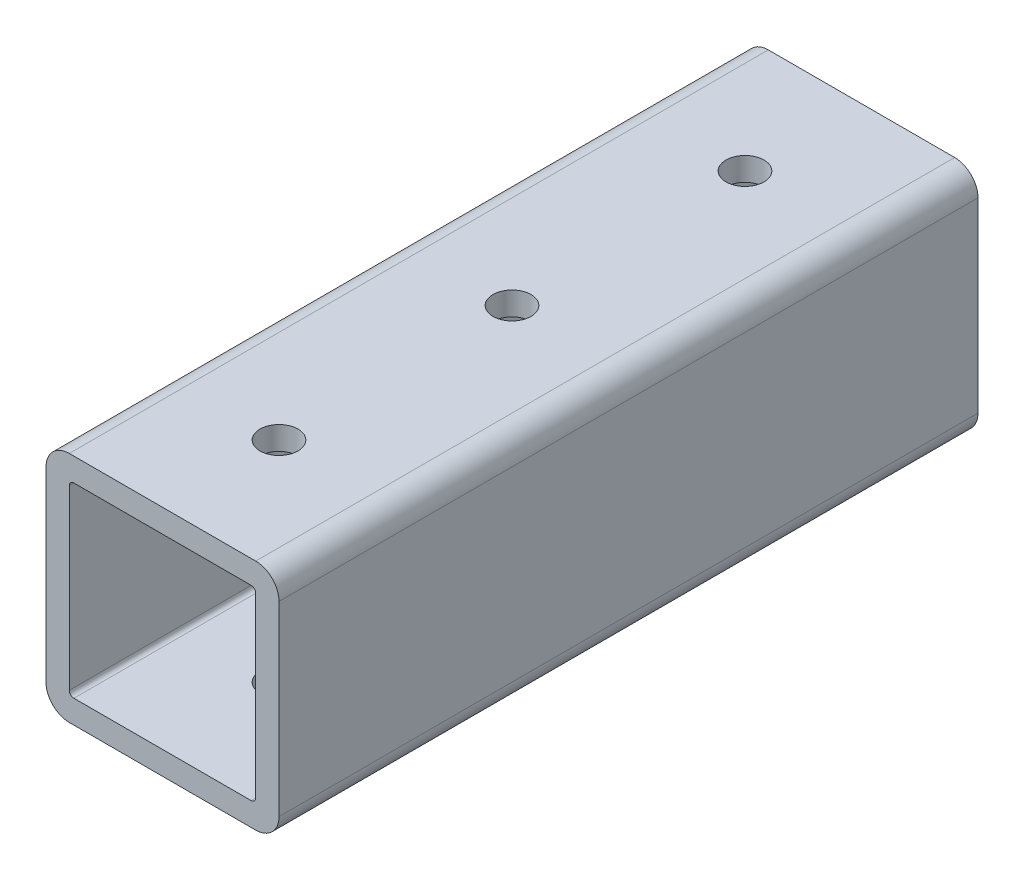
ISO-10303-21;
HEADER;
FILE_DESCRIPTION(('STEP AP214'),'2;1');
FILE_NAME('part.step','',(''),(''),'','','');
FILE_SCHEMA(('AUTOMOTIVE_DESIGN { 1 0 10303 214 1 1 1 1 }'));
ENDSEC;
DATA;
#1=APPLICATION_CONTEXT('core data for automotive mechanical design processes');
#2=APPLICATION_PROTOCOL_DEFINITION('international standard','automotive_design',2000,#1);
#3=PRODUCT_CONTEXT('',#1,'mechanical');
#4=PRODUCT('Part','Part','',(#3));
#5=PRODUCT_RELATED_PRODUCT_CATEGORY('part','',(#4));
#6=PRODUCT_DEFINITION_FORMATION('','',#4);
#7=PRODUCT_DEFINITION_CONTEXT('part definition',#1,'design');
#8=PRODUCT_DEFINITION('design','',#6,#7);
#9=PRODUCT_DEFINITION_SHAPE('','',#8);
#10=(LENGTH_UNIT() NAMED_UNIT(*) SI_UNIT(.MILLI.,.METRE.));
#11=(NAMED_UNIT(*) PLANE_ANGLE_UNIT() SI_UNIT($,.RADIAN.));
#12=(NAMED_UNIT(*) SI_UNIT($,.STERADIAN.) SOLID_ANGLE_UNIT());
#13=UNCERTAINTY_MEASURE_WITH_UNIT(LENGTH_MEASURE(1.E-05),#10,'distance_accuracy_value','');
#14=(GEOMETRIC_REPRESENTATION_CONTEXT(3) GLOBAL_UNCERTAINTY_ASSIGNED_CONTEXT((#13)) GLOBAL_UNIT_ASSIGNED_CONTEXT((#10,
#11,#12)) REPRESENTATION_CONTEXT('',''));
#15=CARTESIAN_POINT('',(0.,0.,0.));
#16=DIRECTION('',(0.,0.,1.));
#17=DIRECTION('',(1.,0.,0.));
#18=AXIS2_PLACEMENT_3D('',#15,#16,#17);
#19=CARTESIAN_POINT('',(-9.65999999999999,9.66,749.3));
#20=DIRECTION('',(0.,0.,1.));
#21=DIRECTION('',(1.,0.,0.));
#22=AXIS2_PLACEMENT_3D('',#19,#20,#21);
#23=CYLINDRICAL_SURFACE('',#22,0.5);
#24=DIRECTION('',(0.,0.,-1.));
#25=VECTOR('',#24,1.);
#26=CARTESIAN_POINT('',(-10.16,9.66,749.3));
#27=LINE('',#26,#25);
#28=CARTESIAN_POINT('',(-10.16,9.66,673.1));
#29=VERTEX_POINT('',#28);
#30=CARTESIAN_POINT('',(-10.16,9.66,749.3));
#31=VERTEX_POINT('',#30);
#32=EDGE_CURVE('E204',#29,#31,#27,.F.);
#33=ORIENTED_EDGE('',*,*,#32,.F.);
#34=CARTESIAN_POINT('',(-9.65999999999999,9.66,673.1));
#35=DIRECTION('',(0.,0.,1.));
#36=DIRECTION('',(1.,0.,0.));
#37=AXIS2_PLACEMENT_3D('',#34,#35,#36);
#38=CIRCLE('',#37,0.5);
#39=CARTESIAN_POINT('',(-9.65999999999999,10.16,673.1));
#40=VERTEX_POINT('',#39);
#41=EDGE_CURVE('E286',#29,#40,#38,.F.);
#42=ORIENTED_EDGE('',*,*,#41,.T.);
#43=DIRECTION('',(0.,0.,-1.));
#44=VECTOR('',#43,1.);
#45=CARTESIAN_POINT('',(-9.65999999999999,10.16,749.3));
#46=LINE('',#45,#44);
#47=CARTESIAN_POINT('',(-9.65999999999999,10.16,749.3));
#48=VERTEX_POINT('',#47);
#49=EDGE_CURVE('E251',#48,#40,#46,.T.);
#50=ORIENTED_EDGE('',*,*,#49,.F.);
#51=CARTESIAN_POINT('',(-9.65999999999999,9.66,749.3));
#52=DIRECTION('',(0.,0.,1.));
#53=DIRECTION('',(1.,0.,0.));
#54=AXIS2_PLACEMENT_3D('',#51,#52,#53);
#55=CIRCLE('',#54,0.5);
#56=EDGE_CURVE('E280',#31,#48,#55,.F.);
#57=ORIENTED_EDGE('',*,*,#56,.F.);
#58=EDGE_LOOP('',(#33,#42,#50,#57));
#59=FACE_BOUND('',#58,.T.);
#60=ADVANCED_FACE('F39',(#59),#23,.F.);
#61=CARTESIAN_POINT('',(0.,-12.7,685.8));
#62=DIRECTION('',(0.,1.,0.));
#63=DIRECTION('',(0.,0.,1.));
#64=AXIS2_PLACEMENT_3D('',#61,#62,#63);
#65=CYLINDRICAL_SURFACE('',#64,2.07009999999996);
#66=CARTESIAN_POINT('',(0.,10.16,685.8));
#67=DIRECTION('',(0.,1.,0.));
#68=DIRECTION('',(0.,0.,1.));
#69=AXIS2_PLACEMENT_3D('',#66,#67,#68);
#70=CIRCLE('',#69,2.07009999999996);
#71=CARTESIAN_POINT('',(0.,10.16,687.8701));
#72=VERTEX_POINT('',#71);
#73=EDGE_CURVE('E248',#72,#72,#70,.T.);
#74=ORIENTED_EDGE('',*,*,#73,.F.);
#75=EDGE_LOOP('',(#74));
#76=FACE_BOUND('',#75,.T.);
#77=CARTESIAN_POINT('',(0.,12.7,685.8));
#78=DIRECTION('',(0.,1.,0.));
#79=DIRECTION('',(0.,0.,1.));
#80=AXIS2_PLACEMENT_3D('',#77,#78,#79);
#81=CIRCLE('',#80,2.07009999999996);
#82=CARTESIAN_POINT('',(0.,12.7,687.8701));
#83=VERTEX_POINT('',#82);
#84=EDGE_CURVE('E272',#83,#83,#81,.T.);
#85=ORIENTED_EDGE('',*,*,#84,.T.);
#86=EDGE_LOOP('',(#85));
#87=FACE_BOUND('',#86,.T.);
#88=ADVANCED_FACE('F365',(#76,#87),#65,.F.);
#89=CARTESIAN_POINT('',(0.,-12.7,711.2));
#90=DIRECTION('',(0.,1.,0.));
#91=DIRECTION('',(0.,0.,1.));
#92=AXIS2_PLACEMENT_3D('',#89,#90,#91);
#93=CYLINDRICAL_SURFACE('',#92,2.07009999999996);
#94=CARTESIAN_POINT('',(0.,10.16,711.2));
#95=DIRECTION('',(0.,1.,0.));
#96=DIRECTION('',(0.,0.,1.));
#97=AXIS2_PLACEMENT_3D('',#94,#95,#96);
#98=CIRCLE('',#97,2.07009999999996);
#99=CARTESIAN_POINT('',(0.,10.16,713.2701));
#100=VERTEX_POINT('',#99);
#101=EDGE_CURVE('E245',#100,#100,#98,.T.);
#102=ORIENTED_EDGE('',*,*,#101,.F.);
#103=EDGE_LOOP('',(#102));
#104=FACE_BOUND('',#103,.T.);
#105=CARTESIAN_POINT('',(0.,12.7,711.2));
#106=DIRECTION('',(0.,1.,0.));
#107=DIRECTION('',(0.,0.,1.));
#108=AXIS2_PLACEMENT_3D('',#105,#106,#107);
#109=CIRCLE('',#108,2.07009999999996);
#110=CARTESIAN_POINT('',(0.,12.7,713.2701));
#111=VERTEX_POINT('',#110);
#112=EDGE_CURVE('E269',#111,#111,#109,.T.);
#113=ORIENTED_EDGE('',*,*,#112,.T.);
#114=EDGE_LOOP('',(#113));
#115=FACE_BOUND('',#114,.T.);
#116=ADVANCED_FACE('F372',(#104,#115),#93,.F.);
#117=CARTESIAN_POINT('',(0.,-12.7,736.6));
#118=DIRECTION('',(0.,1.,0.));
#119=DIRECTION('',(0.,0.,1.));
#120=AXIS2_PLACEMENT_3D('',#117,#118,#119);
#121=CYLINDRICAL_SURFACE('',#120,2.07009999999996);
#122=CARTESIAN_POINT('',(0.,10.16,736.6));
#123=DIRECTION('',(0.,1.,0.));
#124=DIRECTION('',(0.,0.,1.));
#125=AXIS2_PLACEMENT_3D('',#122,#123,#124);
#126=CIRCLE('',#125,2.07009999999996);
#127=CARTESIAN_POINT('',(0.,10.16,738.6701));
#128=VERTEX_POINT('',#127);
#129=EDGE_CURVE('E198',#128,#128,#126,.T.);
#130=ORIENTED_EDGE('',*,*,#129,.F.);
#131=EDGE_LOOP('',(#130));
#132=FACE_BOUND('',#131,.T.);
#133=CARTESIAN_POINT('',(0.,12.7,736.6));
#134=DIRECTION('',(0.,1.,0.));
#135=DIRECTION('',(0.,0.,1.));
#136=AXIS2_PLACEMENT_3D('',#133,#134,#135);
#137=CIRCLE('',#136,2.07009999999996);
#138=CARTESIAN_POINT('',(0.,12.7,738.6701));
#139=VERTEX_POINT('',#138);
#140=EDGE_CURVE('E266',#139,#139,#137,.T.);
#141=ORIENTED_EDGE('',*,*,#140,.T.);
#142=EDGE_LOOP('',(#141));
#143=FACE_BOUND('',#142,.T.);
#144=ADVANCED_FACE('F437',(#132,#143),#121,.F.);
#145=CARTESIAN_POINT('',(9.66,9.65999999999999,749.3));
#146=DIRECTION('',(0.,0.,1.));
#147=DIRECTION('',(1.,0.,0.));
#148=AXIS2_PLACEMENT_3D('',#145,#146,#147);
#149=CYLINDRICAL_SURFACE('',#148,0.5);
#150=DIRECTION('',(0.,0.,-1.));
#151=VECTOR('',#150,1.);
#152=CARTESIAN_POINT('',(9.66,10.16,749.3));
#153=LINE('',#152,#151);
#154=CARTESIAN_POINT('',(9.66,10.16,673.1));
#155=VERTEX_POINT('',#154);
#156=CARTESIAN_POINT('',(9.66,10.16,749.3));
#157=VERTEX_POINT('',#156);
#158=EDGE_CURVE('E203',#155,#157,#153,.F.);
#159=ORIENTED_EDGE('',*,*,#158,.F.);
#160=CARTESIAN_POINT('',(9.66,9.65999999999999,673.1));
#161=DIRECTION('',(0.,0.,1.));
#162=DIRECTION('',(1.,0.,0.));
#163=AXIS2_PLACEMENT_3D('',#160,#161,#162);
#164=CIRCLE('',#163,0.5);
#165=CARTESIAN_POINT('',(10.16,9.65999999999999,673.1));
#166=VERTEX_POINT('',#165);
#167=EDGE_CURVE('E290',#155,#166,#164,.F.);
#168=ORIENTED_EDGE('',*,*,#167,.T.);
#169=DIRECTION('',(0.,0.,1.));
#170=VECTOR('',#169,1.);
#171=CARTESIAN_POINT('',(10.16,9.65999999999999,749.3));
#172=LINE('',#171,#170);
#173=CARTESIAN_POINT('',(10.16,9.65999999999999,749.3));
#174=VERTEX_POINT('',#173);
#175=EDGE_CURVE('E194',#174,#166,#172,.F.);
#176=ORIENTED_EDGE('',*,*,#175,.F.);
#177=CARTESIAN_POINT('',(9.66,9.65999999999999,749.3));
#178=DIRECTION('',(0.,0.,1.));
#179=DIRECTION('',(1.,0.,0.));
#180=AXIS2_PLACEMENT_3D('',#177,#178,#179);
#181=CIRCLE('',#180,0.5);
#182=EDGE_CURVE('E279',#157,#174,#181,.F.);
#183=ORIENTED_EDGE('',*,*,#182,.F.);
#184=EDGE_LOOP('',(#159,#168,#176,#183));
#185=FACE_BOUND('',#184,.T.);
#186=ADVANCED_FACE('F392',(#185),#149,.F.);
#187=CARTESIAN_POINT('',(-9.65999999999999,-9.66,749.3));
#188=DIRECTION('',(0.,0.,1.));
#189=DIRECTION('',(1.,0.,0.));
#190=AXIS2_PLACEMENT_3D('',#187,#188,#189);
#191=CYLINDRICAL_SURFACE('',#190,0.5);
#192=DIRECTION('',(0.,0.,1.));
#193=VECTOR('',#192,1.);
#194=CARTESIAN_POINT('',(-9.65999999999999,-10.16,749.3));
#195=LINE('',#194,#193);
#196=CARTESIAN_POINT('',(-9.65999999999999,-10.16,673.1));
#197=VERTEX_POINT('',#196);
#198=CARTESIAN_POINT('',(-9.65999999999999,-10.16,749.3));
#199=VERTEX_POINT('',#198);
#200=EDGE_CURVE('E200',#197,#199,#195,.T.);
#201=ORIENTED_EDGE('',*,*,#200,.F.);
#202=CARTESIAN_POINT('',(-9.65999999999999,-9.66,673.1));
#203=DIRECTION('',(0.,0.,1.));
#204=DIRECTION('',(1.,0.,0.));
#205=AXIS2_PLACEMENT_3D('',#202,#203,#204);
#206=CIRCLE('',#205,0.5);
#207=CARTESIAN_POINT('',(-10.16,-9.66,673.1));
#208=VERTEX_POINT('',#207);
#209=EDGE_CURVE('E61',#197,#208,#206,.F.);
#210=ORIENTED_EDGE('',*,*,#209,.T.);
#211=DIRECTION('',(0.,0.,-1.));
#212=VECTOR('',#211,1.);
#213=CARTESIAN_POINT('',(-10.16,-9.66,749.3));
#214=LINE('',#213,#212);
#215=CARTESIAN_POINT('',(-10.16,-9.66,749.3));
#216=VERTEX_POINT('',#215);
#217=EDGE_CURVE('E201',#216,#208,#214,.T.);
#218=ORIENTED_EDGE('',*,*,#217,.F.);
#219=CARTESIAN_POINT('',(-9.65999999999999,-9.66,749.3));
#220=DIRECTION('',(0.,0.,1.));
#221=DIRECTION('',(1.,0.,0.));
#222=AXIS2_PLACEMENT_3D('',#219,#220,#221);
#223=CIRCLE('',#222,0.5);
#224=EDGE_CURVE('E277',#199,#216,#223,.F.);
#225=ORIENTED_EDGE('',*,*,#224,.F.);
#226=EDGE_LOOP('',(#201,#210,#218,#225));
#227=FACE_BOUND('',#226,.T.);
#228=ADVANCED_FACE('F381',(#227),#191,.F.);
#229=CARTESIAN_POINT('',(9.66,-9.66,749.3));
#230=DIRECTION('',(0.,0.,1.));
#231=DIRECTION('',(1.,0.,0.));
#232=AXIS2_PLACEMENT_3D('',#229,#230,#231);
#233=CYLINDRICAL_SURFACE('',#232,0.5);
#234=DIRECTION('',(0.,0.,1.));
#235=VECTOR('',#234,1.);
#236=CARTESIAN_POINT('',(10.16,-9.66,749.3));
#237=LINE('',#236,#235);
#238=CARTESIAN_POINT('',(10.16,-9.66,673.1));
#239=VERTEX_POINT('',#238);
#240=CARTESIAN_POINT('',(10.16,-9.66,749.3));
#241=VERTEX_POINT('',#240);
#242=EDGE_CURVE('E197',#239,#241,#237,.T.);
#243=ORIENTED_EDGE('',*,*,#242,.F.);
#244=CARTESIAN_POINT('',(9.66,-9.66,673.1));
#245=DIRECTION('',(0.,0.,1.));
#246=DIRECTION('',(1.,0.,0.));
#247=AXIS2_PLACEMENT_3D('',#244,#245,#246);
#248=CIRCLE('',#247,0.5);
#249=CARTESIAN_POINT('',(9.66,-10.16,673.1));
#250=VERTEX_POINT('',#249);
#251=EDGE_CURVE('E299',#239,#250,#248,.F.);
#252=ORIENTED_EDGE('',*,*,#251,.T.);
#253=DIRECTION('',(0.,0.,1.));
#254=VECTOR('',#253,1.);
#255=CARTESIAN_POINT('',(9.66,-10.16,749.3));
#256=LINE('',#255,#254);
#257=CARTESIAN_POINT('',(9.66,-10.16,749.3));
#258=VERTEX_POINT('',#257);
#259=EDGE_CURVE('E240',#258,#250,#256,.F.);
#260=ORIENTED_EDGE('',*,*,#259,.F.);
#261=CARTESIAN_POINT('',(9.66,-9.66,749.3));
#262=DIRECTION('',(0.,0.,1.));
#263=DIRECTION('',(1.,0.,0.));
#264=AXIS2_PLACEMENT_3D('',#261,#262,#263);
#265=CIRCLE('',#264,0.5);
#266=EDGE_CURVE('E275',#241,#258,#265,.F.);
#267=ORIENTED_EDGE('',*,*,#266,.F.);
#268=EDGE_LOOP('',(#243,#252,#260,#267));
#269=FACE_BOUND('',#268,.T.);
#270=ADVANCED_FACE('F386',(#269),#233,.F.);
#271=CARTESIAN_POINT('',(0.,-12.7,685.8));
#272=DIRECTION('',(0.,1.,0.));
#273=DIRECTION('',(0.,0.,1.));
#274=AXIS2_PLACEMENT_3D('',#271,#272,#273);
#275=CYLINDRICAL_SURFACE('',#274,2.07009999999996);
#276=CARTESIAN_POINT('',(0.,-10.16,685.8));
#277=DIRECTION('',(0.,1.,0.));
#278=DIRECTION('',(0.,0.,1.));
#279=AXIS2_PLACEMENT_3D('',#276,#277,#278);
#280=CIRCLE('',#279,2.07009999999996);
#281=CARTESIAN_POINT('',(0.,-10.16,687.8701));
#282=VERTEX_POINT('',#281);
#283=EDGE_CURVE('E237',#282,#282,#280,.F.);
#284=ORIENTED_EDGE('',*,*,#283,.F.);
#285=EDGE_LOOP('',(#284));
#286=FACE_BOUND('',#285,.T.);
#287=CARTESIAN_POINT('',(0.,-12.7,685.8));
#288=DIRECTION('',(0.,1.,0.));
#289=DIRECTION('',(0.,0.,1.));
#290=AXIS2_PLACEMENT_3D('',#287,#288,#289);
#291=CIRCLE('',#290,2.07009999999996);
#292=CARTESIAN_POINT('',(0.,-12.7,687.8701));
#293=VERTEX_POINT('',#292);
#294=EDGE_CURVE('E260',#293,#293,#291,.F.);
#295=ORIENTED_EDGE('',*,*,#294,.T.);
#296=EDGE_LOOP('',(#295));
#297=FACE_BOUND('',#296,.T.);
#298=ADVANCED_FACE('F428',(#286,#297),#275,.F.);
#299=CARTESIAN_POINT('',(0.,-12.7,711.2));
#300=DIRECTION('',(0.,1.,0.));
#301=DIRECTION('',(0.,0.,1.));
#302=AXIS2_PLACEMENT_3D('',#299,#300,#301);
#303=CYLINDRICAL_SURFACE('',#302,2.07009999999996);
#304=CARTESIAN_POINT('',(0.,-10.16,711.2));
#305=DIRECTION('',(0.,1.,0.));
#306=DIRECTION('',(0.,0.,1.));
#307=AXIS2_PLACEMENT_3D('',#304,#305,#306);
#308=CIRCLE('',#307,2.07009999999996);
#309=CARTESIAN_POINT('',(0.,-10.16,713.2701));
#310=VERTEX_POINT('',#309);
#311=EDGE_CURVE('E234',#310,#310,#308,.F.);
#312=ORIENTED_EDGE('',*,*,#311,.F.);
#313=EDGE_LOOP('',(#312));
#314=FACE_BOUND('',#313,.T.);
#315=CARTESIAN_POINT('',(0.,-12.7,711.2));
#316=DIRECTION('',(0.,1.,0.));
#317=DIRECTION('',(0.,0.,1.));
#318=AXIS2_PLACEMENT_3D('',#315,#316,#317);
#319=CIRCLE('',#318,2.07009999999996);
#320=CARTESIAN_POINT('',(0.,-12.7,713.2701));
#321=VERTEX_POINT('',#320);
#322=EDGE_CURVE('E257',#321,#321,#319,.F.);
#323=ORIENTED_EDGE('',*,*,#322,.T.);
#324=EDGE_LOOP('',(#323));
#325=FACE_BOUND('',#324,.T.);
#326=ADVANCED_FACE('F419',(#314,#325),#303,.F.);
#327=CARTESIAN_POINT('',(0.,-12.7,736.6));
#328=DIRECTION('',(0.,1.,0.));
#329=DIRECTION('',(0.,0.,1.));
#330=AXIS2_PLACEMENT_3D('',#327,#328,#329);
#331=CYLINDRICAL_SURFACE('',#330,2.07009999999996);
#332=CARTESIAN_POINT('',(0.,-10.16,736.6));
#333=DIRECTION('',(0.,1.,0.));
#334=DIRECTION('',(0.,0.,1.));
#335=AXIS2_PLACEMENT_3D('',#332,#333,#334);
#336=CIRCLE('',#335,2.07009999999996);
#337=CARTESIAN_POINT('',(0.,-10.16,738.6701));
#338=VERTEX_POINT('',#337);
#339=EDGE_CURVE('E231',#338,#338,#336,.F.);
#340=ORIENTED_EDGE('',*,*,#339,.F.);
#341=EDGE_LOOP('',(#340));
#342=FACE_BOUND('',#341,.T.);
#343=CARTESIAN_POINT('',(0.,-12.7,736.6));
#344=DIRECTION('',(0.,1.,0.));
#345=DIRECTION('',(0.,0.,1.));
#346=AXIS2_PLACEMENT_3D('',#343,#344,#345);
#347=CIRCLE('',#346,2.07009999999996);
#348=CARTESIAN_POINT('',(0.,-12.7,738.6701));
#349=VERTEX_POINT('',#348);
#350=EDGE_CURVE('E206',#349,#349,#347,.F.);
#351=ORIENTED_EDGE('',*,*,#350,.T.);
#352=EDGE_LOOP('',(#351));
#353=FACE_BOUND('',#352,.T.);
#354=ADVANCED_FACE('F410',(#342,#353),#331,.F.);
#355=CARTESIAN_POINT('',(-10.16,12.7,749.3));
#356=DIRECTION('',(0.,-1.,0.));
#357=DIRECTION('',(0.,0.,-1.));
#358=AXIS2_PLACEMENT_3D('',#355,#356,#357);
#359=PLANE('',#358);
#360=ORIENTED_EDGE('',*,*,#140,.F.);
#361=EDGE_LOOP('',(#360));
#362=FACE_BOUND('',#361,.T.);
#363=ORIENTED_EDGE('',*,*,#112,.F.);
#364=EDGE_LOOP('',(#363));
#365=FACE_BOUND('',#364,.T.);
#366=ORIENTED_EDGE('',*,*,#84,.F.);
#367=EDGE_LOOP('',(#366));
#368=FACE_BOUND('',#367,.T.);
#369=DIRECTION('',(0.,0.,-1.));
#370=VECTOR('',#369,1.);
#371=CARTESIAN_POINT('',(10.16,12.7,749.3));
#372=LINE('',#371,#370);
#373=CARTESIAN_POINT('',(10.16,12.7,673.1));
#374=VERTEX_POINT('',#373);
#375=CARTESIAN_POINT('',(10.16,12.7,749.3));
#376=VERTEX_POINT('',#375);
#377=EDGE_CURVE('E177',#374,#376,#372,.F.);
#378=ORIENTED_EDGE('',*,*,#377,.F.);
#379=DIRECTION('',(-1.,0.,0.));
#380=VECTOR('',#379,1.);
#381=CARTESIAN_POINT('',(-10.16,12.7,673.1));
#382=LINE('',#381,#380);
#383=CARTESIAN_POINT('',(-10.16,12.7,673.1));
#384=VERTEX_POINT('',#383);
#385=EDGE_CURVE('E305',#374,#384,#382,.T.);
#386=ORIENTED_EDGE('',*,*,#385,.T.);
#387=DIRECTION('',(0.,0.,-1.));
#388=VECTOR('',#387,1.);
#389=CARTESIAN_POINT('',(-10.16,12.7,749.3));
#390=LINE('',#389,#388);
#391=CARTESIAN_POINT('',(-10.16,12.7,749.3));
#392=VERTEX_POINT('',#391);
#393=EDGE_CURVE('E212',#392,#384,#390,.T.);
#394=ORIENTED_EDGE('',*,*,#393,.F.);
#395=DIRECTION('',(1.,0.,0.));
#396=VECTOR('',#395,1.);
#397=CARTESIAN_POINT('',(10.16,12.7,749.3));
#398=LINE('',#397,#396);
#399=EDGE_CURVE('E226',#376,#392,#398,.F.);
#400=ORIENTED_EDGE('',*,*,#399,.F.);
#401=EDGE_LOOP('',(#378,#386,#394,#400));
#402=FACE_BOUND('',#401,.T.);
#403=ADVANCED_FACE('F337',(#362,#365,#368,#402),#359,.F.);
#404=CARTESIAN_POINT('',(-10.16,10.16,749.3));
#405=DIRECTION('',(0.,0.,-1.));
#406=DIRECTION('',(-1.,0.,0.));
#407=AXIS2_PLACEMENT_3D('',#404,#405,#406);
#408=CYLINDRICAL_SURFACE('',#407,2.54);
#409=CARTESIAN_POINT('',(-10.16,10.16,673.1));
#410=DIRECTION('',(0.,0.,1.));
#411=DIRECTION('',(1.,0.,0.));
#412=AXIS2_PLACEMENT_3D('',#409,#410,#411);
#413=CIRCLE('',#412,2.54);
#414=CARTESIAN_POINT('',(-12.7,10.16,673.1));
#415=VERTEX_POINT('',#414);
#416=EDGE_CURVE('E308',#415,#384,#413,.F.);
#417=ORIENTED_EDGE('',*,*,#416,.F.);
#418=DIRECTION('',(0.,0.,-1.));
#419=VECTOR('',#418,1.);
#420=CARTESIAN_POINT('',(-12.7,10.16,749.3));
#421=LINE('',#420,#419);
#422=CARTESIAN_POINT('',(-12.7,10.16,749.3));
#423=VERTEX_POINT('',#422);
#424=EDGE_CURVE('E211',#415,#423,#421,.F.);
#425=ORIENTED_EDGE('',*,*,#424,.T.);
#426=CARTESIAN_POINT('',(-10.16,10.16,749.3));
#427=DIRECTION('',(0.,0.,-1.));
#428=DIRECTION('',(-1.,0.,0.));
#429=AXIS2_PLACEMENT_3D('',#426,#427,#428);
#430=CIRCLE('',#429,2.54);
#431=EDGE_CURVE('E193',#392,#423,#430,.F.);
#432=ORIENTED_EDGE('',*,*,#431,.F.);
#433=ORIENTED_EDGE('',*,*,#393,.T.);
#434=EDGE_LOOP('',(#417,#425,#432,#433));
#435=FACE_BOUND('',#434,.T.);
#436=ADVANCED_FACE('F331',(#435),#408,.T.);
#437=CARTESIAN_POINT('',(-12.7,-10.16,749.3));
#438=DIRECTION('',(1.,0.,0.));
#439=DIRECTION('',(0.,0.,-1.));
#440=AXIS2_PLACEMENT_3D('',#437,#438,#439);
#441=PLANE('',#440);
#442=ORIENTED_EDGE('',*,*,#424,.F.);
#443=DIRECTION('',(0.,-1.,0.));
#444=VECTOR('',#443,1.);
#445=CARTESIAN_POINT('',(-12.7,-10.16,673.1));
#446=LINE('',#445,#444);
#447=CARTESIAN_POINT('',(-12.7,-10.16,673.1));
#448=VERTEX_POINT('',#447);
#449=EDGE_CURVE('E310',#415,#448,#446,.T.);
#450=ORIENTED_EDGE('',*,*,#449,.T.);
#451=DIRECTION('',(0.,0.,-1.));
#452=VECTOR('',#451,1.);
#453=CARTESIAN_POINT('',(-12.7,-10.16,749.3));
#454=LINE('',#453,#452);
#455=CARTESIAN_POINT('',(-12.7,-10.16,749.3));
#456=VERTEX_POINT('',#455);
#457=EDGE_CURVE('E207',#456,#448,#454,.T.);
#458=ORIENTED_EDGE('',*,*,#457,.F.);
#459=DIRECTION('',(0.,1.,0.));
#460=VECTOR('',#459,1.);
#461=CARTESIAN_POINT('',(-12.7,-10.16,749.3));
#462=LINE('',#461,#460);
#463=EDGE_CURVE('E190',#423,#456,#462,.F.);
#464=ORIENTED_EDGE('',*,*,#463,.F.);
#465=EDGE_LOOP('',(#442,#450,#458,#464));
#466=FACE_BOUND('',#465,.T.);
#467=ADVANCED_FACE('F328',(#466),#441,.F.);
#468=CARTESIAN_POINT('',(-10.16,-10.16,749.3));
#469=DIRECTION('',(0.,0.,-1.));
#470=DIRECTION('',(-1.,0.,0.));
#471=AXIS2_PLACEMENT_3D('',#468,#469,#470);
#472=CYLINDRICAL_SURFACE('',#471,2.54);
#473=CARTESIAN_POINT('',(-10.16,-10.16,673.1));
#474=DIRECTION('',(0.,0.,1.));
#475=DIRECTION('',(1.,0.,0.));
#476=AXIS2_PLACEMENT_3D('',#473,#474,#475);
#477=CIRCLE('',#476,2.54);
#478=CARTESIAN_POINT('',(-10.16,-12.7,673.1));
#479=VERTEX_POINT('',#478);
#480=EDGE_CURVE('E313',#479,#448,#477,.F.);
#481=ORIENTED_EDGE('',*,*,#480,.F.);
#482=DIRECTION('',(0.,0.,-1.));
#483=VECTOR('',#482,1.);
#484=CARTESIAN_POINT('',(-10.16,-12.7,749.3));
#485=LINE('',#484,#483);
#486=CARTESIAN_POINT('',(-10.16,-12.7,749.3));
#487=VERTEX_POINT('',#486);
#488=EDGE_CURVE('E210',#479,#487,#485,.F.);
#489=ORIENTED_EDGE('',*,*,#488,.T.);
#490=CARTESIAN_POINT('',(-10.16,-10.16,749.3));
#491=DIRECTION('',(0.,0.,-1.));
#492=DIRECTION('',(-1.,0.,0.));
#493=AXIS2_PLACEMENT_3D('',#490,#491,#492);
#494=CIRCLE('',#493,2.54);
#495=EDGE_CURVE('E192',#456,#487,#494,.F.);
#496=ORIENTED_EDGE('',*,*,#495,.F.);
#497=ORIENTED_EDGE('',*,*,#457,.T.);
#498=EDGE_LOOP('',(#481,#489,#496,#497));
#499=FACE_BOUND('',#498,.T.);
#500=ADVANCED_FACE('F322',(#499),#472,.T.);
#501=CARTESIAN_POINT('',(-10.16,-12.7,749.3));
#502=DIRECTION('',(0.,1.,0.));
#503=DIRECTION('',(0.,0.,1.));
#504=AXIS2_PLACEMENT_3D('',#501,#502,#503);
#505=PLANE('',#504);
#506=ORIENTED_EDGE('',*,*,#350,.F.);
#507=EDGE_LOOP('',(#506));
#508=FACE_BOUND('',#507,.T.);
#509=ORIENTED_EDGE('',*,*,#322,.F.);
#510=EDGE_LOOP('',(#509));
#511=FACE_BOUND('',#510,.T.);
#512=ORIENTED_EDGE('',*,*,#294,.F.);
#513=EDGE_LOOP('',(#512));
#514=FACE_BOUND('',#513,.T.);
#515=ORIENTED_EDGE('',*,*,#488,.F.);
#516=DIRECTION('',(1.,0.,0.));
#517=VECTOR('',#516,1.);
#518=CARTESIAN_POINT('',(-10.16,-12.7,673.1));
#519=LINE('',#518,#517);
#520=CARTESIAN_POINT('',(10.16,-12.7,673.1));
#521=VERTEX_POINT('',#520);
#522=EDGE_CURVE('E168',#479,#521,#519,.T.);
#523=ORIENTED_EDGE('',*,*,#522,.T.);
#524=DIRECTION('',(0.,0.,-1.));
#525=VECTOR('',#524,1.);
#526=CARTESIAN_POINT('',(10.16,-12.7,749.3));
#527=LINE('',#526,#525);
#528=CARTESIAN_POINT('',(10.16,-12.7,749.3));
#529=VERTEX_POINT('',#528);
#530=EDGE_CURVE('E167',#529,#521,#527,.T.);
#531=ORIENTED_EDGE('',*,*,#530,.F.);
#532=DIRECTION('',(1.,0.,0.));
#533=VECTOR('',#532,1.);
#534=CARTESIAN_POINT('',(10.16,-12.7,749.3));
#535=LINE('',#534,#533);
#536=EDGE_CURVE('E219',#487,#529,#535,.T.);
#537=ORIENTED_EDGE('',*,*,#536,.F.);
#538=EDGE_LOOP('',(#515,#523,#531,#537));
#539=FACE_BOUND('',#538,.T.);
#540=ADVANCED_FACE('F318',(#508,#511,#514,#539),#505,.F.);
#541=CARTESIAN_POINT('',(-10.16,-10.16,749.3));
#542=DIRECTION('',(1.,0.,0.));
#543=DIRECTION('',(0.,0.,-1.));
#544=AXIS2_PLACEMENT_3D('',#541,#542,#543);
#545=PLANE('',#544);
#546=DIRECTION('',(0.,-1.,0.));
#547=VECTOR('',#546,1.);
#548=CARTESIAN_POINT('',(-10.16,-10.16,673.1));
#549=LINE('',#548,#547);
#550=EDGE_CURVE('E53',#29,#208,#549,.T.);
#551=ORIENTED_EDGE('',*,*,#550,.F.);
#552=ORIENTED_EDGE('',*,*,#32,.T.);
#553=DIRECTION('',(0.,1.,0.));
#554=VECTOR('',#553,1.);
#555=CARTESIAN_POINT('',(-10.16,-10.16,749.3));
#556=LINE('',#555,#554);
#557=EDGE_CURVE('E182',#216,#31,#556,.T.);
#558=ORIENTED_EDGE('',*,*,#557,.F.);
#559=ORIENTED_EDGE('',*,*,#217,.T.);
#560=EDGE_LOOP('',(#551,#552,#558,#559));
#561=FACE_BOUND('',#560,.T.);
#562=ADVANCED_FACE('F399',(#561),#545,.T.);
#563=CARTESIAN_POINT('',(-10.16,10.16,749.3));
#564=DIRECTION('',(0.,-1.,0.));
#565=DIRECTION('',(0.,0.,-1.));
#566=AXIS2_PLACEMENT_3D('',#563,#564,#565);
#567=PLANE('',#566);
#568=DIRECTION('',(-1.,0.,0.));
#569=VECTOR('',#568,1.);
#570=CARTESIAN_POINT('',(-10.16,10.16,673.1));
#571=LINE('',#570,#569);
#572=EDGE_CURVE('E281',#155,#40,#571,.T.);
#573=ORIENTED_EDGE('',*,*,#572,.F.);
#574=ORIENTED_EDGE('',*,*,#158,.T.);
#575=DIRECTION('',(1.,0.,0.));
#576=VECTOR('',#575,1.);
#577=CARTESIAN_POINT('',(10.16,10.16,749.3));
#578=LINE('',#577,#576);
#579=EDGE_CURVE('E189',#48,#157,#578,.T.);
#580=ORIENTED_EDGE('',*,*,#579,.F.);
#581=ORIENTED_EDGE('',*,*,#49,.T.);
#582=EDGE_LOOP('',(#573,#574,#580,#581));
#583=FACE_BOUND('',#582,.T.);
#584=ORIENTED_EDGE('',*,*,#129,.T.);
#585=EDGE_LOOP('',(#584));
#586=FACE_BOUND('',#585,.T.);
#587=ORIENTED_EDGE('',*,*,#101,.T.);
#588=EDGE_LOOP('',(#587));
#589=FACE_BOUND('',#588,.T.);
#590=ORIENTED_EDGE('',*,*,#73,.T.);
#591=EDGE_LOOP('',(#590));
#592=FACE_BOUND('',#591,.T.);
#593=ADVANCED_FACE('F396',(#583,#586,#589,#592),#567,.T.);
#594=CARTESIAN_POINT('',(10.16,-10.16,749.3));
#595=DIRECTION('',(-1.,0.,0.));
#596=DIRECTION('',(0.,0.,1.));
#597=AXIS2_PLACEMENT_3D('',#594,#595,#596);
#598=PLANE('',#597);
#599=DIRECTION('',(0.,1.,0.));
#600=VECTOR('',#599,1.);
#601=CARTESIAN_POINT('',(10.16,-10.16,673.1));
#602=LINE('',#601,#600);
#603=EDGE_CURVE('E295',#239,#166,#602,.T.);
#604=ORIENTED_EDGE('',*,*,#603,.F.);
#605=ORIENTED_EDGE('',*,*,#242,.T.);
#606=DIRECTION('',(0.,1.,0.));
#607=VECTOR('',#606,1.);
#608=CARTESIAN_POINT('',(10.16,-10.16,749.3));
#609=LINE('',#608,#607);
#610=EDGE_CURVE('E186',#174,#241,#609,.F.);
#611=ORIENTED_EDGE('',*,*,#610,.F.);
#612=ORIENTED_EDGE('',*,*,#175,.T.);
#613=EDGE_LOOP('',(#604,#605,#611,#612));
#614=FACE_BOUND('',#613,.T.);
#615=ADVANCED_FACE('F388',(#614),#598,.T.);
#616=CARTESIAN_POINT('',(-10.16,-10.16,749.3));
#617=DIRECTION('',(0.,1.,0.));
#618=DIRECTION('',(0.,0.,1.));
#619=AXIS2_PLACEMENT_3D('',#616,#617,#618);
#620=PLANE('',#619);
#621=DIRECTION('',(1.,0.,0.));
#622=VECTOR('',#621,1.);
#623=CARTESIAN_POINT('',(-10.16,-10.16,673.1));
#624=LINE('',#623,#622);
#625=EDGE_CURVE('E302',#197,#250,#624,.T.);
#626=ORIENTED_EDGE('',*,*,#625,.F.);
#627=ORIENTED_EDGE('',*,*,#200,.T.);
#628=DIRECTION('',(1.,0.,0.));
#629=VECTOR('',#628,1.);
#630=CARTESIAN_POINT('',(10.16,-10.16,749.3));
#631=LINE('',#630,#629);
#632=EDGE_CURVE('E185',#258,#199,#631,.F.);
#633=ORIENTED_EDGE('',*,*,#632,.F.);
#634=ORIENTED_EDGE('',*,*,#259,.T.);
#635=EDGE_LOOP('',(#626,#627,#633,#634));
#636=FACE_BOUND('',#635,.T.);
#637=ORIENTED_EDGE('',*,*,#339,.T.);
#638=EDGE_LOOP('',(#637));
#639=FACE_BOUND('',#638,.T.);
#640=ORIENTED_EDGE('',*,*,#311,.T.);
#641=EDGE_LOOP('',(#640));
#642=FACE_BOUND('',#641,.T.);
#643=ORIENTED_EDGE('',*,*,#283,.T.);
#644=EDGE_LOOP('',(#643));
#645=FACE_BOUND('',#644,.T.);
#646=ADVANCED_FACE('F353',(#636,#639,#642,#645),#620,.T.);
#647=CARTESIAN_POINT('',(10.16,-10.16,749.3));
#648=DIRECTION('',(0.,0.,-1.));
#649=DIRECTION('',(-1.,0.,0.));
#650=AXIS2_PLACEMENT_3D('',#647,#648,#649);
#651=CYLINDRICAL_SURFACE('',#650,2.54);
#652=CARTESIAN_POINT('',(10.16,-10.16,673.1));
#653=DIRECTION('',(0.,0.,1.));
#654=DIRECTION('',(1.,0.,0.));
#655=AXIS2_PLACEMENT_3D('',#652,#653,#654);
#656=CIRCLE('',#655,2.54);
#657=CARTESIAN_POINT('',(12.7,-10.16,673.1));
#658=VERTEX_POINT('',#657);
#659=EDGE_CURVE('E153',#658,#521,#656,.F.);
#660=ORIENTED_EDGE('',*,*,#659,.F.);
#661=DIRECTION('',(0.,0.,1.));
#662=VECTOR('',#661,1.);
#663=CARTESIAN_POINT('',(12.7,-10.16,749.3));
#664=LINE('',#663,#662);
#665=CARTESIAN_POINT('',(12.7,-10.16,749.3));
#666=VERTEX_POINT('',#665);
#667=EDGE_CURVE('E165',#658,#666,#664,.T.);
#668=ORIENTED_EDGE('',*,*,#667,.T.);
#669=CARTESIAN_POINT('',(10.16,-10.16,749.3));
#670=DIRECTION('',(0.,0.,-1.));
#671=DIRECTION('',(-1.,0.,0.));
#672=AXIS2_PLACEMENT_3D('',#669,#670,#671);
#673=CIRCLE('',#672,2.54);
#674=EDGE_CURVE('E228',#529,#666,#673,.F.);
#675=ORIENTED_EDGE('',*,*,#674,.F.);
#676=ORIENTED_EDGE('',*,*,#530,.T.);
#677=EDGE_LOOP('',(#660,#668,#675,#676));
#678=FACE_BOUND('',#677,.T.);
#679=ADVANCED_FACE('F163',(#678),#651,.T.);
#680=CARTESIAN_POINT('',(10.16,-10.16,749.3));
#681=DIRECTION('',(0.,0.,1.));
#682=DIRECTION('',(1.,0.,0.));
#683=AXIS2_PLACEMENT_3D('',#680,#681,#682);
#684=PLANE('',#683);
#685=ORIENTED_EDGE('',*,*,#557,.T.);
#686=ORIENTED_EDGE('',*,*,#56,.T.);
#687=ORIENTED_EDGE('',*,*,#579,.T.);
#688=ORIENTED_EDGE('',*,*,#182,.T.);
#689=ORIENTED_EDGE('',*,*,#610,.T.);
#690=ORIENTED_EDGE('',*,*,#266,.T.);
#691=ORIENTED_EDGE('',*,*,#632,.T.);
#692=ORIENTED_EDGE('',*,*,#224,.T.);
#693=EDGE_LOOP('',(#685,#686,#687,#688,#689,#690,#691,#692));
#694=FACE_BOUND('',#693,.T.);
#695=ORIENTED_EDGE('',*,*,#495,.T.);
#696=ORIENTED_EDGE('',*,*,#536,.T.);
#697=ORIENTED_EDGE('',*,*,#674,.T.);
#698=DIRECTION('',(0.,1.,0.));
#699=VECTOR('',#698,1.);
#700=CARTESIAN_POINT('',(12.7,-10.16,749.3));
#701=LINE('',#700,#699);
#702=CARTESIAN_POINT('',(12.7,10.16,749.3));
#703=VERTEX_POINT('',#702);
#704=EDGE_CURVE('E173',#666,#703,#701,.T.);
#705=ORIENTED_EDGE('',*,*,#704,.T.);
#706=CARTESIAN_POINT('',(10.16,10.16,749.3));
#707=DIRECTION('',(0.,0.,-1.));
#708=DIRECTION('',(-1.,0.,0.));
#709=AXIS2_PLACEMENT_3D('',#706,#707,#708);
#710=CIRCLE('',#709,2.54);
#711=EDGE_CURVE('E174',#376,#703,#710,.T.);
#712=ORIENTED_EDGE('',*,*,#711,.F.);
#713=ORIENTED_EDGE('',*,*,#399,.T.);
#714=ORIENTED_EDGE('',*,*,#431,.T.);
#715=ORIENTED_EDGE('',*,*,#463,.T.);
#716=EDGE_LOOP('',(#695,#696,#697,#705,#712,#713,#714,#715));
#717=FACE_BOUND('',#716,.T.);
#718=ADVANCED_FACE('F342',(#694,#717),#684,.T.);
#719=CARTESIAN_POINT('',(10.16,10.16,749.3));
#720=DIRECTION('',(0.,0.,-1.));
#721=DIRECTION('',(-1.,0.,0.));
#722=AXIS2_PLACEMENT_3D('',#719,#720,#721);
#723=CYLINDRICAL_SURFACE('',#722,2.54);
#724=CARTESIAN_POINT('',(10.16,10.16,673.1));
#725=DIRECTION('',(0.,0.,1.));
#726=DIRECTION('',(1.,0.,0.));
#727=AXIS2_PLACEMENT_3D('',#724,#725,#726);
#728=CIRCLE('',#727,2.54);
#729=CARTESIAN_POINT('',(12.7,10.16,673.1));
#730=VERTEX_POINT('',#729);
#731=EDGE_CURVE('E156',#374,#730,#728,.F.);
#732=ORIENTED_EDGE('',*,*,#731,.F.);
#733=ORIENTED_EDGE('',*,*,#377,.T.);
#734=ORIENTED_EDGE('',*,*,#711,.T.);
#735=DIRECTION('',(0.,0.,1.));
#736=VECTOR('',#735,1.);
#737=CARTESIAN_POINT('',(12.7,10.16,749.3));
#738=LINE('',#737,#736);
#739=EDGE_CURVE('E46',#703,#730,#738,.F.);
#740=ORIENTED_EDGE('',*,*,#739,.T.);
#741=EDGE_LOOP('',(#732,#733,#734,#740));
#742=FACE_BOUND('',#741,.T.);
#743=ADVANCED_FACE('F340',(#742),#723,.T.);
#744=CARTESIAN_POINT('',(12.7,-10.16,749.3));
#745=DIRECTION('',(-1.,0.,0.));
#746=DIRECTION('',(0.,0.,1.));
#747=AXIS2_PLACEMENT_3D('',#744,#745,#746);
#748=PLANE('',#747);
#749=ORIENTED_EDGE('',*,*,#667,.F.);
#750=DIRECTION('',(0.,1.,0.));
#751=VECTOR('',#750,1.);
#752=CARTESIAN_POINT('',(12.7,-10.16,673.1));
#753=LINE('',#752,#751);
#754=EDGE_CURVE('E12',#658,#730,#753,.T.);
#755=ORIENTED_EDGE('',*,*,#754,.T.);
#756=ORIENTED_EDGE('',*,*,#739,.F.);
#757=ORIENTED_EDGE('',*,*,#704,.F.);
#758=EDGE_LOOP('',(#749,#755,#756,#757));
#759=FACE_BOUND('',#758,.T.);
#760=ADVANCED_FACE('F171',(#759),#748,.F.);
#761=CARTESIAN_POINT('',(0.,0.,673.1));
#762=DIRECTION('',(0.,0.,1.));
#763=DIRECTION('',(1.,0.,0.));
#764=AXIS2_PLACEMENT_3D('',#761,#762,#763);
#765=PLANE('',#764);
#766=ORIENTED_EDGE('',*,*,#167,.F.);
#767=ORIENTED_EDGE('',*,*,#572,.T.);
#768=ORIENTED_EDGE('',*,*,#41,.F.);
#769=ORIENTED_EDGE('',*,*,#550,.T.);
#770=ORIENTED_EDGE('',*,*,#209,.F.);
#771=ORIENTED_EDGE('',*,*,#625,.T.);
#772=ORIENTED_EDGE('',*,*,#251,.F.);
#773=ORIENTED_EDGE('',*,*,#603,.T.);
#774=EDGE_LOOP('',(#766,#767,#768,#769,#770,#771,#772,#773));
#775=FACE_BOUND('',#774,.T.);
#776=ORIENTED_EDGE('',*,*,#385,.F.);
#777=ORIENTED_EDGE('',*,*,#731,.T.);
#778=ORIENTED_EDGE('',*,*,#754,.F.);
#779=ORIENTED_EDGE('',*,*,#659,.T.);
#780=ORIENTED_EDGE('',*,*,#522,.F.);
#781=ORIENTED_EDGE('',*,*,#480,.T.);
#782=ORIENTED_EDGE('',*,*,#449,.F.);
#783=ORIENTED_EDGE('',*,*,#416,.T.);
#784=EDGE_LOOP('',(#776,#777,#778,#779,#780,#781,#782,#783));
#785=FACE_BOUND('',#784,.T.);
#786=ADVANCED_FACE('F152',(#775,#785),#765,.F.);
#787=CLOSED_SHELL('',(#60,#88,#116,#144,#186,#228,#270,#298,#326,#354,#403,#436,#467,#500,#540,
#562,#593,#615,#646,#679,#718,#743,#760,#786));
#788=MANIFOLD_SOLID_BREP('B2',#787);
#789=ADVANCED_BREP_SHAPE_REPRESENTATION('',(#18,#788),#14);
#790=SHAPE_DEFINITION_REPRESENTATION(#9,#789);
ENDSEC;
END-ISO-10303-21;
